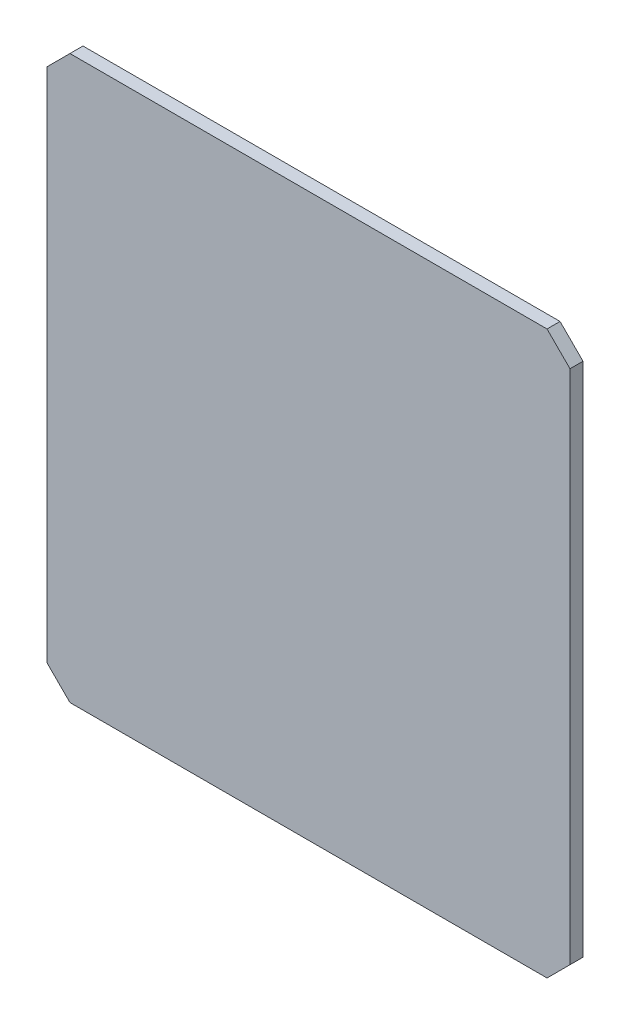
ISO-10303-21;
HEADER;
FILE_DESCRIPTION(('STEP AP214'),'2;1');
FILE_NAME('part.step','',(''),(''),'','','');
FILE_SCHEMA(('AUTOMOTIVE_DESIGN { 1 0 10303 214 1 1 1 1 }'));
ENDSEC;
DATA;
#1=APPLICATION_CONTEXT('core data for automotive mechanical design processes');
#2=APPLICATION_PROTOCOL_DEFINITION('international standard','automotive_design',2000,#1);
#3=PRODUCT_CONTEXT('',#1,'mechanical');
#4=PRODUCT('Part','Part','',(#3));
#5=PRODUCT_RELATED_PRODUCT_CATEGORY('part','',(#4));
#6=PRODUCT_DEFINITION_FORMATION('','',#4);
#7=PRODUCT_DEFINITION_CONTEXT('part definition',#1,'design');
#8=PRODUCT_DEFINITION('design','',#6,#7);
#9=PRODUCT_DEFINITION_SHAPE('','',#8);
#10=(LENGTH_UNIT() NAMED_UNIT(*) SI_UNIT(.MILLI.,.METRE.));
#11=(NAMED_UNIT(*) PLANE_ANGLE_UNIT() SI_UNIT($,.RADIAN.));
#12=(NAMED_UNIT(*) SI_UNIT($,.STERADIAN.) SOLID_ANGLE_UNIT());
#13=UNCERTAINTY_MEASURE_WITH_UNIT(LENGTH_MEASURE(1.E-05),#10,'distance_accuracy_value','');
#14=(GEOMETRIC_REPRESENTATION_CONTEXT(3) GLOBAL_UNCERTAINTY_ASSIGNED_CONTEXT((#13)) GLOBAL_UNIT_ASSIGNED_CONTEXT((#10,
#11,#12)) REPRESENTATION_CONTEXT('',''));
#15=CARTESIAN_POINT('',(0.,0.,0.));
#16=DIRECTION('',(0.,0.,1.));
#17=DIRECTION('',(1.,0.,0.));
#18=AXIS2_PLACEMENT_3D('',#15,#16,#17);
#19=CARTESIAN_POINT('',(-713.,367.,17.));
#20=DIRECTION('',(1.,0.,0.));
#21=DIRECTION('',(0.,1.,0.));
#22=AXIS2_PLACEMENT_3D('',#19,#20,#21);
#23=PLANE('',#22);
#24=DIRECTION('',(0.,-1.,0.));
#25=VECTOR('',#24,1.);
#26=CARTESIAN_POINT('',(-713.,367.,0.));
#27=LINE('',#26,#25);
#28=CARTESIAN_POINT('',(-713.,337.,0.));
#29=VERTEX_POINT('',#28);
#30=CARTESIAN_POINT('',(-713.,-337.,0.));
#31=VERTEX_POINT('',#30);
#32=EDGE_CURVE('E112',#29,#31,#27,.T.);
#33=ORIENTED_EDGE('',*,*,#32,.T.);
#34=DIRECTION('',(0.,0.,1.));
#35=VECTOR('',#34,1.);
#36=CARTESIAN_POINT('',(-713.,-337.,17.));
#37=LINE('',#36,#35);
#38=CARTESIAN_POINT('',(-713.,-337.,17.));
#39=VERTEX_POINT('',#38);
#40=EDGE_CURVE('E135',#31,#39,#37,.T.);
#41=ORIENTED_EDGE('',*,*,#40,.T.);
#42=DIRECTION('',(0.,-1.,0.));
#43=VECTOR('',#42,1.);
#44=CARTESIAN_POINT('',(-713.,367.,17.));
#45=LINE('',#44,#43);
#46=CARTESIAN_POINT('',(-713.,337.,17.));
#47=VERTEX_POINT('',#46);
#48=EDGE_CURVE('E110',#47,#39,#45,.T.);
#49=ORIENTED_EDGE('',*,*,#48,.F.);
#50=DIRECTION('',(0.,0.,-1.));
#51=VECTOR('',#50,1.);
#52=CARTESIAN_POINT('',(-713.,337.,17.));
#53=LINE('',#52,#51);
#54=EDGE_CURVE('E132',#47,#29,#53,.T.);
#55=ORIENTED_EDGE('',*,*,#54,.T.);
#56=EDGE_LOOP('',(#33,#41,#49,#55));
#57=FACE_BOUND('',#56,.T.);
#58=ADVANCED_FACE('F17',(#57),#23,.F.);
#59=CARTESIAN_POINT('',(-713.,-367.,17.));
#60=DIRECTION('',(0.,1.,0.));
#61=DIRECTION('',(0.,0.,1.));
#62=AXIS2_PLACEMENT_3D('',#59,#60,#61);
#63=PLANE('',#62);
#64=DIRECTION('',(1.,0.,0.));
#65=VECTOR('',#64,1.);
#66=CARTESIAN_POINT('',(-713.,-367.,0.));
#67=LINE('',#66,#65);
#68=CARTESIAN_POINT('',(-683.,-367.,0.));
#69=VERTEX_POINT('',#68);
#70=CARTESIAN_POINT('',(-60.,-367.,0.));
#71=VERTEX_POINT('',#70);
#72=EDGE_CURVE('E108',#69,#71,#67,.T.);
#73=ORIENTED_EDGE('',*,*,#72,.T.);
#74=DIRECTION('',(0.,0.,1.));
#75=VECTOR('',#74,1.);
#76=CARTESIAN_POINT('',(-60.,-367.,17.));
#77=LINE('',#76,#75);
#78=CARTESIAN_POINT('',(-60.,-367.,17.));
#79=VERTEX_POINT('',#78);
#80=EDGE_CURVE('E87',#71,#79,#77,.T.);
#81=ORIENTED_EDGE('',*,*,#80,.T.);
#82=DIRECTION('',(1.,0.,0.));
#83=VECTOR('',#82,1.);
#84=CARTESIAN_POINT('',(-713.,-367.,17.));
#85=LINE('',#84,#83);
#86=CARTESIAN_POINT('',(-683.,-367.,17.));
#87=VERTEX_POINT('',#86);
#88=EDGE_CURVE('E151',#87,#79,#85,.T.);
#89=ORIENTED_EDGE('',*,*,#88,.F.);
#90=DIRECTION('',(0.,0.,-1.));
#91=VECTOR('',#90,1.);
#92=CARTESIAN_POINT('',(-683.,-367.,17.));
#93=LINE('',#92,#91);
#94=EDGE_CURVE('E92',#87,#69,#93,.T.);
#95=ORIENTED_EDGE('',*,*,#94,.T.);
#96=EDGE_LOOP('',(#73,#81,#89,#95));
#97=FACE_BOUND('',#96,.T.);
#98=ADVANCED_FACE('F170',(#97),#63,.F.);
#99=CARTESIAN_POINT('',(-30.,367.,17.));
#100=DIRECTION('',(-1.,0.,0.));
#101=DIRECTION('',(0.,-1.,0.));
#102=AXIS2_PLACEMENT_3D('',#99,#100,#101);
#103=PLANE('',#102);
#104=DIRECTION('',(0.,1.,0.));
#105=VECTOR('',#104,1.);
#106=CARTESIAN_POINT('',(-30.,367.,17.));
#107=LINE('',#106,#105);
#108=CARTESIAN_POINT('',(-30.,-337.,17.));
#109=VERTEX_POINT('',#108);
#110=CARTESIAN_POINT('',(-30.,337.,17.));
#111=VERTEX_POINT('',#110);
#112=EDGE_CURVE('E101',#109,#111,#107,.T.);
#113=ORIENTED_EDGE('',*,*,#112,.F.);
#114=DIRECTION('',(0.,0.,-1.));
#115=VECTOR('',#114,1.);
#116=CARTESIAN_POINT('',(-30.,-337.,17.));
#117=LINE('',#116,#115);
#118=CARTESIAN_POINT('',(-30.,-337.,0.));
#119=VERTEX_POINT('',#118);
#120=EDGE_CURVE('E86',#109,#119,#117,.T.);
#121=ORIENTED_EDGE('',*,*,#120,.T.);
#122=DIRECTION('',(0.,1.,0.));
#123=VECTOR('',#122,1.);
#124=CARTESIAN_POINT('',(-30.,367.,0.));
#125=LINE('',#124,#123);
#126=CARTESIAN_POINT('',(-30.,337.,0.));
#127=VERTEX_POINT('',#126);
#128=EDGE_CURVE('E99',#119,#127,#125,.T.);
#129=ORIENTED_EDGE('',*,*,#128,.T.);
#130=DIRECTION('',(0.,0.,1.));
#131=VECTOR('',#130,1.);
#132=CARTESIAN_POINT('',(-30.,337.,17.));
#133=LINE('',#132,#131);
#134=EDGE_CURVE('E103',#127,#111,#133,.T.);
#135=ORIENTED_EDGE('',*,*,#134,.T.);
#136=EDGE_LOOP('',(#113,#121,#129,#135));
#137=FACE_BOUND('',#136,.T.);
#138=ADVANCED_FACE('F98',(#137),#103,.F.);
#139=CARTESIAN_POINT('',(-713.,367.,17.));
#140=DIRECTION('',(0.,-1.,0.));
#141=DIRECTION('',(0.,0.,-1.));
#142=AXIS2_PLACEMENT_3D('',#139,#140,#141);
#143=PLANE('',#142);
#144=DIRECTION('',(-1.,0.,0.));
#145=VECTOR('',#144,1.);
#146=CARTESIAN_POINT('',(-713.,367.,0.));
#147=LINE('',#146,#145);
#148=CARTESIAN_POINT('',(-60.,367.,0.));
#149=VERTEX_POINT('',#148);
#150=CARTESIAN_POINT('',(-683.,367.,0.));
#151=VERTEX_POINT('',#150);
#152=EDGE_CURVE('E107',#149,#151,#147,.T.);
#153=ORIENTED_EDGE('',*,*,#152,.T.);
#154=DIRECTION('',(0.,0.,1.));
#155=VECTOR('',#154,1.);
#156=CARTESIAN_POINT('',(-683.,367.,17.));
#157=LINE('',#156,#155);
#158=CARTESIAN_POINT('',(-683.,367.,17.));
#159=VERTEX_POINT('',#158);
#160=EDGE_CURVE('E11',#151,#159,#157,.T.);
#161=ORIENTED_EDGE('',*,*,#160,.T.);
#162=DIRECTION('',(-1.,0.,0.));
#163=VECTOR('',#162,1.);
#164=CARTESIAN_POINT('',(-713.,367.,17.));
#165=LINE('',#164,#163);
#166=CARTESIAN_POINT('',(-60.,367.,17.));
#167=VERTEX_POINT('',#166);
#168=EDGE_CURVE('E116',#167,#159,#165,.T.);
#169=ORIENTED_EDGE('',*,*,#168,.F.);
#170=DIRECTION('',(0.,0.,-1.));
#171=VECTOR('',#170,1.);
#172=CARTESIAN_POINT('',(-60.,367.,17.));
#173=LINE('',#172,#171);
#174=EDGE_CURVE('E25',#167,#149,#173,.T.);
#175=ORIENTED_EDGE('',*,*,#174,.T.);
#176=EDGE_LOOP('',(#153,#161,#169,#175));
#177=FACE_BOUND('',#176,.T.);
#178=ADVANCED_FACE('F138',(#177),#143,.F.);
#179=CARTESIAN_POINT('',(0.,0.,17.));
#180=DIRECTION('',(0.,0.,1.));
#181=DIRECTION('',(1.,0.,0.));
#182=AXIS2_PLACEMENT_3D('',#179,#180,#181);
#183=PLANE('',#182);
#184=ORIENTED_EDGE('',*,*,#88,.T.);
#185=DIRECTION('',(-0.707106781186549,-0.707106781186546,0.));
#186=VECTOR('',#185,1.);
#187=CARTESIAN_POINT('',(153.5,-153.5,17.));
#188=LINE('',#187,#186);
#189=EDGE_CURVE('E130',#79,#109,#188,.F.);
#190=ORIENTED_EDGE('',*,*,#189,.T.);
#191=ORIENTED_EDGE('',*,*,#112,.T.);
#192=DIRECTION('',(0.707106781186547,-0.707106781186549,0.));
#193=VECTOR('',#192,1.);
#194=CARTESIAN_POINT('',(153.5,153.5,17.));
#195=LINE('',#194,#193);
#196=EDGE_CURVE('E37',#111,#167,#195,.F.);
#197=ORIENTED_EDGE('',*,*,#196,.T.);
#198=ORIENTED_EDGE('',*,*,#168,.T.);
#199=DIRECTION('',(0.707106781186549,0.707106781186546,0.));
#200=VECTOR('',#199,1.);
#201=CARTESIAN_POINT('',(-525.,525.,17.));
#202=LINE('',#201,#200);
#203=EDGE_CURVE('E126',#159,#47,#202,.F.);
#204=ORIENTED_EDGE('',*,*,#203,.T.);
#205=ORIENTED_EDGE('',*,*,#48,.T.);
#206=DIRECTION('',(-0.707106781186546,0.707106781186549,0.));
#207=VECTOR('',#206,1.);
#208=CARTESIAN_POINT('',(-525.,-525.,17.));
#209=LINE('',#208,#207);
#210=EDGE_CURVE('E128',#39,#87,#209,.F.);
#211=ORIENTED_EDGE('',*,*,#210,.T.);
#212=EDGE_LOOP('',(#184,#190,#191,#197,#198,#204,#205,#211));
#213=FACE_BOUND('',#212,.T.);
#214=ADVANCED_FACE('F157',(#213),#183,.T.);
#215=CARTESIAN_POINT('',(0.,0.,0.));
#216=DIRECTION('',(0.,0.,1.));
#217=DIRECTION('',(1.,0.,0.));
#218=AXIS2_PLACEMENT_3D('',#215,#216,#217);
#219=PLANE('',#218);
#220=ORIENTED_EDGE('',*,*,#128,.F.);
#221=DIRECTION('',(0.707106781186549,0.707106781186546,0.));
#222=VECTOR('',#221,1.);
#223=CARTESIAN_POINT('',(-30.,-337.,0.));
#224=LINE('',#223,#222);
#225=EDGE_CURVE('E82',#119,#71,#224,.F.);
#226=ORIENTED_EDGE('',*,*,#225,.T.);
#227=ORIENTED_EDGE('',*,*,#72,.F.);
#228=DIRECTION('',(0.707106781186546,-0.707106781186549,0.));
#229=VECTOR('',#228,1.);
#230=CARTESIAN_POINT('',(-683.,-367.,0.));
#231=LINE('',#230,#229);
#232=EDGE_CURVE('E93',#69,#31,#231,.F.);
#233=ORIENTED_EDGE('',*,*,#232,.T.);
#234=ORIENTED_EDGE('',*,*,#32,.F.);
#235=DIRECTION('',(-0.707106781186549,-0.707106781186546,0.));
#236=VECTOR('',#235,1.);
#237=CARTESIAN_POINT('',(-713.,337.,0.));
#238=LINE('',#237,#236);
#239=EDGE_CURVE('E119',#29,#151,#238,.F.);
#240=ORIENTED_EDGE('',*,*,#239,.T.);
#241=ORIENTED_EDGE('',*,*,#152,.F.);
#242=DIRECTION('',(-0.707106781186547,0.707106781186549,0.));
#243=VECTOR('',#242,1.);
#244=CARTESIAN_POINT('',(-60.,367.,0.));
#245=LINE('',#244,#243);
#246=EDGE_CURVE('E102',#149,#127,#245,.F.);
#247=ORIENTED_EDGE('',*,*,#246,.T.);
#248=EDGE_LOOP('',(#220,#226,#227,#233,#234,#240,#241,#247));
#249=FACE_BOUND('',#248,.T.);
#250=ADVANCED_FACE('F105',(#249),#219,.F.);
#251=CARTESIAN_POINT('',(-30.,-337.,17.));
#252=DIRECTION('',(-0.707106781186546,0.707106781186549,0.));
#253=DIRECTION('',(0.,0.,-1.));
#254=AXIS2_PLACEMENT_3D('',#251,#252,#253);
#255=PLANE('',#254);
#256=ORIENTED_EDGE('',*,*,#189,.F.);
#257=ORIENTED_EDGE('',*,*,#80,.F.);
#258=ORIENTED_EDGE('',*,*,#225,.F.);
#259=ORIENTED_EDGE('',*,*,#120,.F.);
#260=EDGE_LOOP('',(#256,#257,#258,#259));
#261=FACE_BOUND('',#260,.T.);
#262=ADVANCED_FACE('F85',(#261),#255,.F.);
#263=CARTESIAN_POINT('',(-683.,-367.,17.));
#264=DIRECTION('',(0.707106781186549,0.707106781186546,0.));
#265=DIRECTION('',(0.,0.,-1.));
#266=AXIS2_PLACEMENT_3D('',#263,#264,#265);
#267=PLANE('',#266);
#268=ORIENTED_EDGE('',*,*,#210,.F.);
#269=ORIENTED_EDGE('',*,*,#40,.F.);
#270=ORIENTED_EDGE('',*,*,#232,.F.);
#271=ORIENTED_EDGE('',*,*,#94,.F.);
#272=EDGE_LOOP('',(#268,#269,#270,#271));
#273=FACE_BOUND('',#272,.T.);
#274=ADVANCED_FACE('F182',(#273),#267,.F.);
#275=CARTESIAN_POINT('',(-713.,337.,17.));
#276=DIRECTION('',(0.707106781186546,-0.707106781186549,0.));
#277=DIRECTION('',(0.,0.,-1.));
#278=AXIS2_PLACEMENT_3D('',#275,#276,#277);
#279=PLANE('',#278);
#280=ORIENTED_EDGE('',*,*,#203,.F.);
#281=ORIENTED_EDGE('',*,*,#160,.F.);
#282=ORIENTED_EDGE('',*,*,#239,.F.);
#283=ORIENTED_EDGE('',*,*,#54,.F.);
#284=EDGE_LOOP('',(#280,#281,#282,#283));
#285=FACE_BOUND('',#284,.T.);
#286=ADVANCED_FACE('F145',(#285),#279,.F.);
#287=CARTESIAN_POINT('',(-60.,367.,17.));
#288=DIRECTION('',(-0.707106781186549,-0.707106781186547,0.));
#289=DIRECTION('',(0.,0.,-1.));
#290=AXIS2_PLACEMENT_3D('',#287,#288,#289);
#291=PLANE('',#290);
#292=ORIENTED_EDGE('',*,*,#196,.F.);
#293=ORIENTED_EDGE('',*,*,#134,.F.);
#294=ORIENTED_EDGE('',*,*,#246,.F.);
#295=ORIENTED_EDGE('',*,*,#174,.F.);
#296=EDGE_LOOP('',(#292,#293,#294,#295));
#297=FACE_BOUND('',#296,.T.);
#298=ADVANCED_FACE('F19',(#297),#291,.F.);
#299=CLOSED_SHELL('',(#58,#98,#138,#178,#214,#250,#262,#274,#286,#298));
#300=MANIFOLD_SOLID_BREP('B1',#299);
#301=ADVANCED_BREP_SHAPE_REPRESENTATION('',(#18,#300),#14);
#302=SHAPE_DEFINITION_REPRESENTATION(#9,#301);
ENDSEC;
END-ISO-10303-21;
